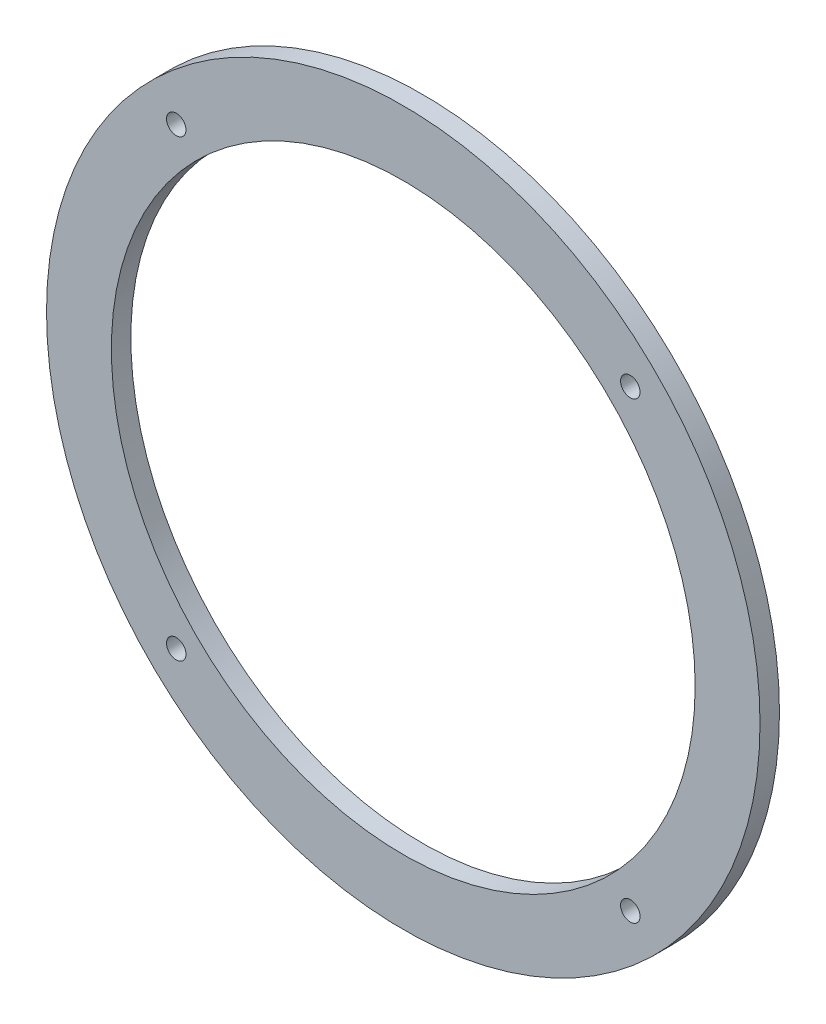
ISO-10303-21;
HEADER;
FILE_DESCRIPTION(('STEP AP214'),'2;1');
FILE_NAME('part.step','',(''),(''),'','','');
FILE_SCHEMA(('AUTOMOTIVE_DESIGN { 1 0 10303 214 1 1 1 1 }'));
ENDSEC;
DATA;
#1=APPLICATION_CONTEXT('core data for automotive mechanical design processes');
#2=APPLICATION_PROTOCOL_DEFINITION('international standard','automotive_design',2000,#1);
#3=PRODUCT_CONTEXT('',#1,'mechanical');
#4=PRODUCT('Part','Part','',(#3));
#5=PRODUCT_RELATED_PRODUCT_CATEGORY('part','',(#4));
#6=PRODUCT_DEFINITION_FORMATION('','',#4);
#7=PRODUCT_DEFINITION_CONTEXT('part definition',#1,'design');
#8=PRODUCT_DEFINITION('design','',#6,#7);
#9=PRODUCT_DEFINITION_SHAPE('','',#8);
#10=(LENGTH_UNIT() NAMED_UNIT(*) SI_UNIT(.MILLI.,.METRE.));
#11=(NAMED_UNIT(*) PLANE_ANGLE_UNIT() SI_UNIT($,.RADIAN.));
#12=(NAMED_UNIT(*) SI_UNIT($,.STERADIAN.) SOLID_ANGLE_UNIT());
#13=UNCERTAINTY_MEASURE_WITH_UNIT(LENGTH_MEASURE(1.E-05),#10,'distance_accuracy_value','');
#14=(GEOMETRIC_REPRESENTATION_CONTEXT(3) GLOBAL_UNCERTAINTY_ASSIGNED_CONTEXT((#13)) GLOBAL_UNIT_ASSIGNED_CONTEXT((#10,
#11,#12)) REPRESENTATION_CONTEXT('',''));
#15=CARTESIAN_POINT('',(0.,0.,0.));
#16=DIRECTION('',(0.,0.,1.));
#17=DIRECTION('',(1.,0.,0.));
#18=AXIS2_PLACEMENT_3D('',#15,#16,#17);
#19=CARTESIAN_POINT('',(35.,-35.,3.));
#20=DIRECTION('',(0.,0.,-1.));
#21=DIRECTION('',(-1.,0.,0.));
#22=AXIS2_PLACEMENT_3D('',#19,#20,#21);
#23=CYLINDRICAL_SURFACE('',#22,1.5);
#24=CARTESIAN_POINT('',(35.,-35.,3.));
#25=DIRECTION('',(0.,0.,1.));
#26=DIRECTION('',(1.,0.,0.));
#27=AXIS2_PLACEMENT_3D('',#24,#25,#26);
#28=CIRCLE('',#27,1.5);
#29=CARTESIAN_POINT('',(36.5,-35.,3.));
#30=VERTEX_POINT('',#29);
#31=EDGE_CURVE('E45',#30,#30,#28,.T.);
#32=ORIENTED_EDGE('',*,*,#31,.T.);
#33=EDGE_LOOP('',(#32));
#34=FACE_BOUND('',#33,.T.);
#35=CARTESIAN_POINT('',(35.,-35.,0.));
#36=DIRECTION('',(0.,0.,1.));
#37=DIRECTION('',(1.,0.,0.));
#38=AXIS2_PLACEMENT_3D('',#35,#36,#37);
#39=CIRCLE('',#38,1.5);
#40=CARTESIAN_POINT('',(36.5,-35.,0.));
#41=VERTEX_POINT('',#40);
#42=EDGE_CURVE('E65',#41,#41,#39,.T.);
#43=ORIENTED_EDGE('',*,*,#42,.F.);
#44=EDGE_LOOP('',(#43));
#45=FACE_BOUND('',#44,.T.);
#46=ADVANCED_FACE('F37',(#34,#45),#23,.F.);
#47=CARTESIAN_POINT('',(-35.,-35.,3.));
#48=DIRECTION('',(0.,0.,-1.));
#49=DIRECTION('',(-1.,0.,0.));
#50=AXIS2_PLACEMENT_3D('',#47,#48,#49);
#51=CYLINDRICAL_SURFACE('',#50,1.5);
#52=CARTESIAN_POINT('',(-35.,-35.,3.));
#53=DIRECTION('',(0.,0.,1.));
#54=DIRECTION('',(1.,0.,0.));
#55=AXIS2_PLACEMENT_3D('',#52,#53,#54);
#56=CIRCLE('',#55,1.5);
#57=CARTESIAN_POINT('',(-33.5,-35.,3.));
#58=VERTEX_POINT('',#57);
#59=EDGE_CURVE('E50',#58,#58,#56,.T.);
#60=ORIENTED_EDGE('',*,*,#59,.T.);
#61=EDGE_LOOP('',(#60));
#62=FACE_BOUND('',#61,.T.);
#63=CARTESIAN_POINT('',(-35.,-35.,0.));
#64=DIRECTION('',(0.,0.,1.));
#65=DIRECTION('',(1.,0.,0.));
#66=AXIS2_PLACEMENT_3D('',#63,#64,#65);
#67=CIRCLE('',#66,1.5);
#68=CARTESIAN_POINT('',(-33.5,-35.,0.));
#69=VERTEX_POINT('',#68);
#70=EDGE_CURVE('E63',#69,#69,#67,.T.);
#71=ORIENTED_EDGE('',*,*,#70,.F.);
#72=EDGE_LOOP('',(#71));
#73=FACE_BOUND('',#72,.T.);
#74=ADVANCED_FACE('F86',(#62,#73),#51,.F.);
#75=CARTESIAN_POINT('',(35.,35.,3.));
#76=DIRECTION('',(0.,0.,-1.));
#77=DIRECTION('',(-1.,0.,0.));
#78=AXIS2_PLACEMENT_3D('',#75,#76,#77);
#79=CYLINDRICAL_SURFACE('',#78,1.5);
#80=CARTESIAN_POINT('',(35.,35.,3.));
#81=DIRECTION('',(0.,0.,1.));
#82=DIRECTION('',(1.,0.,0.));
#83=AXIS2_PLACEMENT_3D('',#80,#81,#82);
#84=CIRCLE('',#83,1.5);
#85=CARTESIAN_POINT('',(36.5,35.,3.));
#86=VERTEX_POINT('',#85);
#87=EDGE_CURVE('E79',#86,#86,#84,.T.);
#88=ORIENTED_EDGE('',*,*,#87,.T.);
#89=EDGE_LOOP('',(#88));
#90=FACE_BOUND('',#89,.T.);
#91=CARTESIAN_POINT('',(35.,35.,0.));
#92=DIRECTION('',(0.,0.,1.));
#93=DIRECTION('',(1.,0.,0.));
#94=AXIS2_PLACEMENT_3D('',#91,#92,#93);
#95=CIRCLE('',#94,1.5);
#96=CARTESIAN_POINT('',(36.5,35.,0.));
#97=VERTEX_POINT('',#96);
#98=EDGE_CURVE('E60',#97,#97,#95,.T.);
#99=ORIENTED_EDGE('',*,*,#98,.F.);
#100=EDGE_LOOP('',(#99));
#101=FACE_BOUND('',#100,.T.);
#102=ADVANCED_FACE('F104',(#90,#101),#79,.F.);
#103=CARTESIAN_POINT('',(-35.,35.,3.));
#104=DIRECTION('',(0.,0.,-1.));
#105=DIRECTION('',(-1.,0.,0.));
#106=AXIS2_PLACEMENT_3D('',#103,#104,#105);
#107=CYLINDRICAL_SURFACE('',#106,1.5);
#108=CARTESIAN_POINT('',(-35.,35.,3.));
#109=DIRECTION('',(0.,0.,1.));
#110=DIRECTION('',(1.,0.,0.));
#111=AXIS2_PLACEMENT_3D('',#108,#109,#110);
#112=CIRCLE('',#111,1.5);
#113=CARTESIAN_POINT('',(-33.5,35.,3.));
#114=VERTEX_POINT('',#113);
#115=EDGE_CURVE('E74',#114,#114,#112,.T.);
#116=ORIENTED_EDGE('',*,*,#115,.T.);
#117=EDGE_LOOP('',(#116));
#118=FACE_BOUND('',#117,.T.);
#119=CARTESIAN_POINT('',(-35.,35.,0.));
#120=DIRECTION('',(0.,0.,1.));
#121=DIRECTION('',(1.,0.,0.));
#122=AXIS2_PLACEMENT_3D('',#119,#120,#121);
#123=CIRCLE('',#122,1.5);
#124=CARTESIAN_POINT('',(-33.5,35.,0.));
#125=VERTEX_POINT('',#124);
#126=EDGE_CURVE('E57',#125,#125,#123,.T.);
#127=ORIENTED_EDGE('',*,*,#126,.F.);
#128=EDGE_LOOP('',(#127));
#129=FACE_BOUND('',#128,.T.);
#130=ADVANCED_FACE('F110',(#118,#129),#107,.F.);
#131=CARTESIAN_POINT('',(0.,0.,3.));
#132=DIRECTION('',(0.,0.,-1.));
#133=DIRECTION('',(-1.,0.,0.));
#134=AXIS2_PLACEMENT_3D('',#131,#132,#133);
#135=CYLINDRICAL_SURFACE('',#134,45.);
#136=CARTESIAN_POINT('',(0.,0.,3.));
#137=DIRECTION('',(0.,0.,1.));
#138=DIRECTION('',(1.,0.,0.));
#139=AXIS2_PLACEMENT_3D('',#136,#137,#138);
#140=CIRCLE('',#139,45.);
#141=CARTESIAN_POINT('',(45.,0.,3.));
#142=VERTEX_POINT('',#141);
#143=EDGE_CURVE('E70',#142,#142,#140,.T.);
#144=ORIENTED_EDGE('',*,*,#143,.T.);
#145=EDGE_LOOP('',(#144));
#146=FACE_BOUND('',#145,.T.);
#147=CARTESIAN_POINT('',(0.,0.,0.));
#148=DIRECTION('',(0.,0.,1.));
#149=DIRECTION('',(1.,0.,0.));
#150=AXIS2_PLACEMENT_3D('',#147,#148,#149);
#151=CIRCLE('',#150,45.);
#152=CARTESIAN_POINT('',(45.,0.,0.));
#153=VERTEX_POINT('',#152);
#154=EDGE_CURVE('E54',#153,#153,#151,.T.);
#155=ORIENTED_EDGE('',*,*,#154,.F.);
#156=EDGE_LOOP('',(#155));
#157=FACE_BOUND('',#156,.T.);
#158=ADVANCED_FACE('F39',(#146,#157),#135,.F.);
#159=CARTESIAN_POINT('',(0.,0.,3.));
#160=DIRECTION('',(0.,0.,-1.));
#161=DIRECTION('',(-1.,0.,0.));
#162=AXIS2_PLACEMENT_3D('',#159,#160,#161);
#163=CYLINDRICAL_SURFACE('',#162,55.);
#164=CARTESIAN_POINT('',(0.,0.,3.));
#165=DIRECTION('',(0.,0.,1.));
#166=DIRECTION('',(1.,0.,0.));
#167=AXIS2_PLACEMENT_3D('',#164,#165,#166);
#168=CIRCLE('',#167,55.);
#169=CARTESIAN_POINT('',(55.,0.,3.));
#170=VERTEX_POINT('',#169);
#171=EDGE_CURVE('E10',#170,#170,#168,.T.);
#172=ORIENTED_EDGE('',*,*,#171,.F.);
#173=EDGE_LOOP('',(#172));
#174=FACE_BOUND('',#173,.T.);
#175=CARTESIAN_POINT('',(0.,0.,0.));
#176=DIRECTION('',(0.,0.,1.));
#177=DIRECTION('',(1.,0.,0.));
#178=AXIS2_PLACEMENT_3D('',#175,#176,#177);
#179=CIRCLE('',#178,55.);
#180=CARTESIAN_POINT('',(55.,0.,0.));
#181=VERTEX_POINT('',#180);
#182=EDGE_CURVE('E41',#181,#181,#179,.T.);
#183=ORIENTED_EDGE('',*,*,#182,.T.);
#184=EDGE_LOOP('',(#183));
#185=FACE_BOUND('',#184,.T.);
#186=ADVANCED_FACE('F93',(#174,#185),#163,.T.);
#187=CARTESIAN_POINT('',(0.,0.,3.));
#188=DIRECTION('',(0.,0.,1.));
#189=DIRECTION('',(1.,0.,0.));
#190=AXIS2_PLACEMENT_3D('',#187,#188,#189);
#191=PLANE('',#190);
#192=ORIENTED_EDGE('',*,*,#143,.F.);
#193=EDGE_LOOP('',(#192));
#194=FACE_BOUND('',#193,.T.);
#195=ORIENTED_EDGE('',*,*,#115,.F.);
#196=EDGE_LOOP('',(#195));
#197=FACE_BOUND('',#196,.T.);
#198=ORIENTED_EDGE('',*,*,#87,.F.);
#199=EDGE_LOOP('',(#198));
#200=FACE_BOUND('',#199,.T.);
#201=ORIENTED_EDGE('',*,*,#59,.F.);
#202=EDGE_LOOP('',(#201));
#203=FACE_BOUND('',#202,.T.);
#204=ORIENTED_EDGE('',*,*,#31,.F.);
#205=EDGE_LOOP('',(#204));
#206=FACE_BOUND('',#205,.T.);
#207=ORIENTED_EDGE('',*,*,#171,.T.);
#208=EDGE_LOOP('',(#207));
#209=FACE_BOUND('',#208,.T.);
#210=ADVANCED_FACE('F89',(#194,#197,#200,#203,#206,#209),#191,.T.);
#211=CARTESIAN_POINT('',(0.,0.,0.));
#212=DIRECTION('',(0.,0.,1.));
#213=DIRECTION('',(1.,0.,0.));
#214=AXIS2_PLACEMENT_3D('',#211,#212,#213);
#215=PLANE('',#214);
#216=ORIENTED_EDGE('',*,*,#154,.T.);
#217=EDGE_LOOP('',(#216));
#218=FACE_BOUND('',#217,.T.);
#219=ORIENTED_EDGE('',*,*,#126,.T.);
#220=EDGE_LOOP('',(#219));
#221=FACE_BOUND('',#220,.T.);
#222=ORIENTED_EDGE('',*,*,#98,.T.);
#223=EDGE_LOOP('',(#222));
#224=FACE_BOUND('',#223,.T.);
#225=ORIENTED_EDGE('',*,*,#70,.T.);
#226=EDGE_LOOP('',(#225));
#227=FACE_BOUND('',#226,.T.);
#228=ORIENTED_EDGE('',*,*,#42,.T.);
#229=EDGE_LOOP('',(#228));
#230=FACE_BOUND('',#229,.T.);
#231=ORIENTED_EDGE('',*,*,#182,.F.);
#232=EDGE_LOOP('',(#231));
#233=FACE_BOUND('',#232,.T.);
#234=ADVANCED_FACE('F92',(#218,#221,#224,#227,#230,#233),#215,.F.);
#235=CLOSED_SHELL('',(#46,#74,#102,#130,#158,#186,#210,#234));
#236=MANIFOLD_SOLID_BREP('B2',#235);
#237=ADVANCED_BREP_SHAPE_REPRESENTATION('',(#18,#236),#14);
#238=SHAPE_DEFINITION_REPRESENTATION(#9,#237);
ENDSEC;
END-ISO-10303-21;
